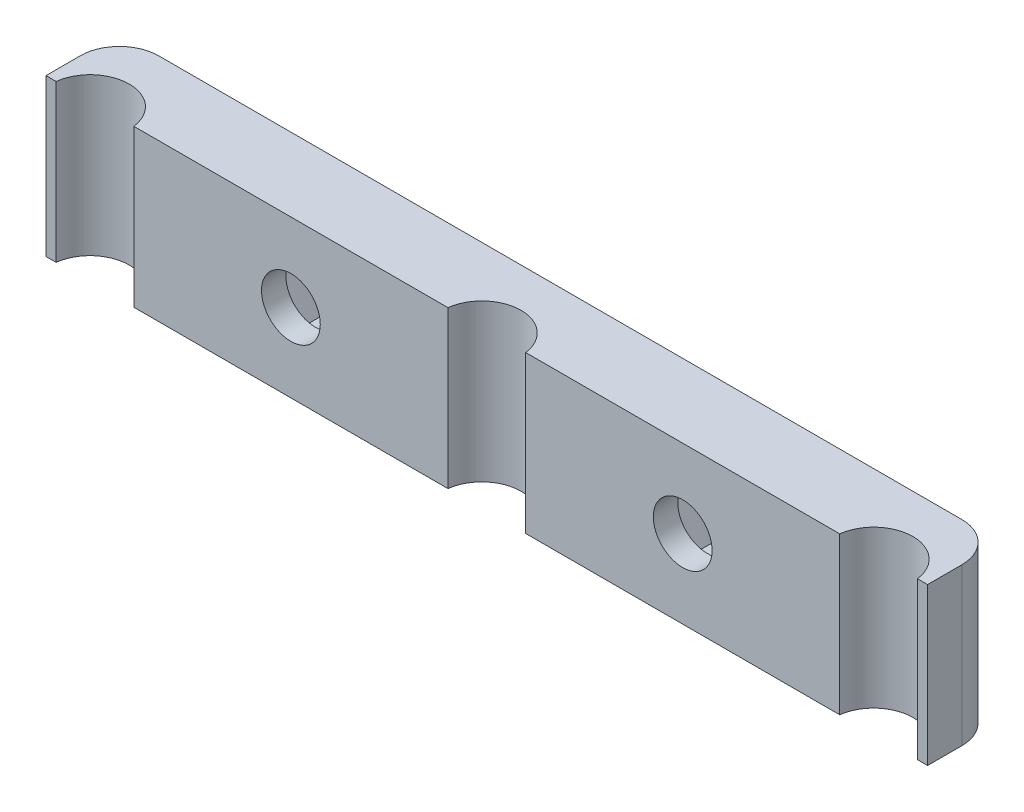
ISO-10303-21;
HEADER;
FILE_DESCRIPTION(('STEP AP214'),'2;1');
FILE_NAME('part.step','',(''),(''),'','','');
FILE_SCHEMA(('AUTOMOTIVE_DESIGN { 1 0 10303 214 1 1 1 1 }'));
ENDSEC;
DATA;
#1=APPLICATION_CONTEXT('core data for automotive mechanical design processes');
#2=APPLICATION_PROTOCOL_DEFINITION('international standard','automotive_design',2000,#1);
#3=PRODUCT_CONTEXT('',#1,'mechanical');
#4=PRODUCT('Part','Part','',(#3));
#5=PRODUCT_RELATED_PRODUCT_CATEGORY('part','',(#4));
#6=PRODUCT_DEFINITION_FORMATION('','',#4);
#7=PRODUCT_DEFINITION_CONTEXT('part definition',#1,'design');
#8=PRODUCT_DEFINITION('design','',#6,#7);
#9=PRODUCT_DEFINITION_SHAPE('','',#8);
#10=(LENGTH_UNIT() NAMED_UNIT(*) SI_UNIT(.MILLI.,.METRE.));
#11=(NAMED_UNIT(*) PLANE_ANGLE_UNIT() SI_UNIT($,.RADIAN.));
#12=(NAMED_UNIT(*) SI_UNIT($,.STERADIAN.) SOLID_ANGLE_UNIT());
#13=UNCERTAINTY_MEASURE_WITH_UNIT(LENGTH_MEASURE(1.E-05),#10,'distance_accuracy_value','');
#14=(GEOMETRIC_REPRESENTATION_CONTEXT(3) GLOBAL_UNCERTAINTY_ASSIGNED_CONTEXT((#13)) GLOBAL_UNIT_ASSIGNED_CONTEXT((#10,
#11,#12)) REPRESENTATION_CONTEXT('',''));
#15=CARTESIAN_POINT('',(0.,0.,0.));
#16=DIRECTION('',(0.,0.,1.));
#17=DIRECTION('',(1.,0.,0.));
#18=AXIS2_PLACEMENT_3D('',#15,#16,#17);
#19=CARTESIAN_POINT('',(-10.,0.,-4.));
#20=DIRECTION('',(0.,0.,1.));
#21=DIRECTION('',(1.,0.,0.));
#22=AXIS2_PLACEMENT_3D('',#19,#20,#21);
#23=CYLINDRICAL_SURFACE('',#22,1.5);
#24=CARTESIAN_POINT('',(-10.,0.,-0.25));
#25=DIRECTION('',(0.,0.,1.));
#26=DIRECTION('',(1.,0.,0.));
#27=AXIS2_PLACEMENT_3D('',#24,#25,#26);
#28=CIRCLE('',#27,1.5);
#29=CARTESIAN_POINT('',(-8.5,0.,-0.25));
#30=VERTEX_POINT('',#29);
#31=EDGE_CURVE('E300',#30,#30,#28,.T.);
#32=ORIENTED_EDGE('',*,*,#31,.T.);
#33=EDGE_LOOP('',(#32));
#34=FACE_BOUND('',#33,.T.);
#35=CARTESIAN_POINT('',(-10.,0.,-1.5));
#36=DIRECTION('',(0.,0.,-1.));
#37=DIRECTION('',(-1.,0.,0.));
#38=AXIS2_PLACEMENT_3D('',#35,#36,#37);
#39=CIRCLE('',#38,1.5);
#40=CARTESIAN_POINT('',(-11.5,0.,-1.5));
#41=VERTEX_POINT('',#40);
#42=EDGE_CURVE('E37',#41,#41,#39,.F.);
#43=ORIENTED_EDGE('',*,*,#42,.F.);
#44=EDGE_LOOP('',(#43));
#45=FACE_BOUND('',#44,.T.);
#46=ADVANCED_FACE('F33',(#34,#45),#23,.F.);
#47=CARTESIAN_POINT('',(10.,0.,-4.));
#48=DIRECTION('',(0.,0.,1.));
#49=DIRECTION('',(1.,0.,0.));
#50=AXIS2_PLACEMENT_3D('',#47,#48,#49);
#51=CYLINDRICAL_SURFACE('',#50,1.5);
#52=CARTESIAN_POINT('',(10.,0.,-0.25));
#53=DIRECTION('',(0.,0.,1.));
#54=DIRECTION('',(1.,0.,0.));
#55=AXIS2_PLACEMENT_3D('',#52,#53,#54);
#56=CIRCLE('',#55,1.5);
#57=CARTESIAN_POINT('',(11.5,0.,-0.25));
#58=VERTEX_POINT('',#57);
#59=EDGE_CURVE('E297',#58,#58,#56,.T.);
#60=ORIENTED_EDGE('',*,*,#59,.T.);
#61=EDGE_LOOP('',(#60));
#62=FACE_BOUND('',#61,.T.);
#63=CARTESIAN_POINT('',(10.,0.,-1.5));
#64=DIRECTION('',(0.,0.,-1.));
#65=DIRECTION('',(-1.,0.,0.));
#66=AXIS2_PLACEMENT_3D('',#63,#64,#65);
#67=CIRCLE('',#66,1.5);
#68=CARTESIAN_POINT('',(8.5,0.,-1.5));
#69=VERTEX_POINT('',#68);
#70=EDGE_CURVE('E287',#69,#69,#67,.F.);
#71=ORIENTED_EDGE('',*,*,#70,.F.);
#72=EDGE_LOOP('',(#71));
#73=FACE_BOUND('',#72,.T.);
#74=ADVANCED_FACE('F390',(#62,#73),#51,.F.);
#75=CARTESIAN_POINT('',(-22.5,4.,-4.));
#76=DIRECTION('',(1.,0.,0.));
#77=DIRECTION('',(0.,0.,-1.));
#78=AXIS2_PLACEMENT_3D('',#75,#76,#77);
#79=PLANE('',#78);
#80=DIRECTION('',(0.,0.,1.));
#81=VECTOR('',#80,1.);
#82=CARTESIAN_POINT('',(-22.5,4.,-4.));
#83=LINE('',#82,#81);
#84=CARTESIAN_POINT('',(-22.5,4.,-2.));
#85=VERTEX_POINT('',#84);
#86=CARTESIAN_POINT('',(-22.5,4.,-0.25));
#87=VERTEX_POINT('',#86);
#88=EDGE_CURVE('E304',#85,#87,#83,.T.);
#89=ORIENTED_EDGE('',*,*,#88,.F.);
#90=DIRECTION('',(0.,-1.,0.));
#91=VECTOR('',#90,1.);
#92=CARTESIAN_POINT('',(-22.5,4.,-2.));
#93=LINE('',#92,#91);
#94=CARTESIAN_POINT('',(-22.5,-4.,-2.));
#95=VERTEX_POINT('',#94);
#96=EDGE_CURVE('E371',#85,#95,#93,.T.);
#97=ORIENTED_EDGE('',*,*,#96,.T.);
#98=DIRECTION('',(0.,0.,1.));
#99=VECTOR('',#98,1.);
#100=CARTESIAN_POINT('',(-22.5,-4.,-4.));
#101=LINE('',#100,#99);
#102=CARTESIAN_POINT('',(-22.5,-4.,-0.25));
#103=VERTEX_POINT('',#102);
#104=EDGE_CURVE('E303',#95,#103,#101,.T.);
#105=ORIENTED_EDGE('',*,*,#104,.T.);
#106=DIRECTION('',(0.,-1.,0.));
#107=VECTOR('',#106,1.);
#108=CARTESIAN_POINT('',(-22.5,4.,-0.25));
#109=LINE('',#108,#107);
#110=EDGE_CURVE('E368',#87,#103,#109,.T.);
#111=ORIENTED_EDGE('',*,*,#110,.F.);
#112=EDGE_LOOP('',(#89,#97,#105,#111));
#113=FACE_BOUND('',#112,.T.);
#114=ADVANCED_FACE('F392',(#113),#79,.F.);
#115=CARTESIAN_POINT('',(-22.5,4.,-0.25));
#116=DIRECTION('',(0.,0.,-1.));
#117=DIRECTION('',(-1.,0.,0.));
#118=AXIS2_PLACEMENT_3D('',#115,#116,#117);
#119=PLANE('',#118);
#120=DIRECTION('',(1.,0.,0.));
#121=VECTOR('',#120,1.);
#122=CARTESIAN_POINT('',(-22.5,-4.,-0.25));
#123=LINE('',#122,#121);
#124=CARTESIAN_POINT('',(-21.9843134832984,-4.,-0.250000000000001));
#125=VERTEX_POINT('',#124);
#126=EDGE_CURVE('E329',#103,#125,#123,.T.);
#127=ORIENTED_EDGE('',*,*,#126,.T.);
#128=DIRECTION('',(0.,-1.,0.));
#129=VECTOR('',#128,1.);
#130=CARTESIAN_POINT('',(-21.9843134832984,4.,-0.250000000000001));
#131=LINE('',#130,#129);
#132=CARTESIAN_POINT('',(-21.9843134832984,4.,-0.250000000000001));
#133=VERTEX_POINT('',#132);
#134=EDGE_CURVE('E365',#133,#125,#131,.T.);
#135=ORIENTED_EDGE('',*,*,#134,.F.);
#136=DIRECTION('',(1.,0.,0.));
#137=VECTOR('',#136,1.);
#138=CARTESIAN_POINT('',(-22.5,4.,-0.25));
#139=LINE('',#138,#137);
#140=EDGE_CURVE('E306',#87,#133,#139,.T.);
#141=ORIENTED_EDGE('',*,*,#140,.F.);
#142=ORIENTED_EDGE('',*,*,#110,.T.);
#143=EDGE_LOOP('',(#127,#135,#141,#142));
#144=FACE_BOUND('',#143,.T.);
#145=ADVANCED_FACE('F399',(#144),#119,.F.);
#146=CARTESIAN_POINT('',(-20.,4.,0.));
#147=DIRECTION('',(0.,-1.,0.));
#148=DIRECTION('',(0.,0.,-1.));
#149=AXIS2_PLACEMENT_3D('',#146,#147,#148);
#150=CYLINDRICAL_SURFACE('',#149,2.);
#151=CARTESIAN_POINT('',(-20.,-4.,0.));
#152=DIRECTION('',(0.,-1.,0.));
#153=DIRECTION('',(0.,0.,1.));
#154=AXIS2_PLACEMENT_3D('',#151,#152,#153);
#155=CIRCLE('',#154,2.);
#156=CARTESIAN_POINT('',(-18.0156865167016,-4.,-0.25));
#157=VERTEX_POINT('',#156);
#158=EDGE_CURVE('E331',#125,#157,#155,.T.);
#159=ORIENTED_EDGE('',*,*,#158,.T.);
#160=DIRECTION('',(0.,-1.,0.));
#161=VECTOR('',#160,1.);
#162=CARTESIAN_POINT('',(-18.0156865167016,4.,-0.25));
#163=LINE('',#162,#161);
#164=CARTESIAN_POINT('',(-18.0156865167016,4.,-0.25));
#165=VERTEX_POINT('',#164);
#166=EDGE_CURVE('E362',#165,#157,#163,.T.);
#167=ORIENTED_EDGE('',*,*,#166,.F.);
#168=CARTESIAN_POINT('',(-20.,4.,0.));
#169=DIRECTION('',(0.,-1.,0.));
#170=DIRECTION('',(0.,0.,1.));
#171=AXIS2_PLACEMENT_3D('',#168,#169,#170);
#172=CIRCLE('',#171,2.);
#173=EDGE_CURVE('E309',#133,#165,#172,.T.);
#174=ORIENTED_EDGE('',*,*,#173,.F.);
#175=ORIENTED_EDGE('',*,*,#134,.T.);
#176=EDGE_LOOP('',(#159,#167,#174,#175));
#177=FACE_BOUND('',#176,.T.);
#178=ADVANCED_FACE('F444',(#177),#150,.F.);
#179=CARTESIAN_POINT('',(-18.0156865167016,4.,-0.25));
#180=DIRECTION('',(0.,0.,-1.));
#181=DIRECTION('',(-1.,0.,0.));
#182=AXIS2_PLACEMENT_3D('',#179,#180,#181);
#183=PLANE('',#182);
#184=ORIENTED_EDGE('',*,*,#31,.F.);
#185=EDGE_LOOP('',(#184));
#186=FACE_BOUND('',#185,.T.);
#187=DIRECTION('',(1.,0.,0.));
#188=VECTOR('',#187,1.);
#189=CARTESIAN_POINT('',(-18.0156865167016,-4.,-0.25));
#190=LINE('',#189,#188);
#191=CARTESIAN_POINT('',(-1.98431348329844,-4.,-0.25));
#192=VERTEX_POINT('',#191);
#193=EDGE_CURVE('E333',#157,#192,#190,.T.);
#194=ORIENTED_EDGE('',*,*,#193,.T.);
#195=DIRECTION('',(0.,-1.,0.));
#196=VECTOR('',#195,1.);
#197=CARTESIAN_POINT('',(-1.98431348329844,4.,-0.25));
#198=LINE('',#197,#196);
#199=CARTESIAN_POINT('',(-1.98431348329844,4.,-0.25));
#200=VERTEX_POINT('',#199);
#201=EDGE_CURVE('E359',#200,#192,#198,.T.);
#202=ORIENTED_EDGE('',*,*,#201,.F.);
#203=DIRECTION('',(1.,0.,0.));
#204=VECTOR('',#203,1.);
#205=CARTESIAN_POINT('',(-18.0156865167016,4.,-0.25));
#206=LINE('',#205,#204);
#207=EDGE_CURVE('E311',#165,#200,#206,.T.);
#208=ORIENTED_EDGE('',*,*,#207,.F.);
#209=ORIENTED_EDGE('',*,*,#166,.T.);
#210=EDGE_LOOP('',(#194,#202,#208,#209));
#211=FACE_BOUND('',#210,.T.);
#212=ADVANCED_FACE('F440',(#186,#211),#183,.F.);
#213=CARTESIAN_POINT('',(0.,4.,0.));
#214=DIRECTION('',(0.,-1.,0.));
#215=DIRECTION('',(0.,0.,-1.));
#216=AXIS2_PLACEMENT_3D('',#213,#214,#215);
#217=CYLINDRICAL_SURFACE('',#216,2.);
#218=CARTESIAN_POINT('',(0.,-4.,0.));
#219=DIRECTION('',(0.,-1.,0.));
#220=DIRECTION('',(0.,0.,1.));
#221=AXIS2_PLACEMENT_3D('',#218,#219,#220);
#222=CIRCLE('',#221,2.);
#223=CARTESIAN_POINT('',(1.98431348329844,-4.,-0.25));
#224=VERTEX_POINT('',#223);
#225=EDGE_CURVE('E335',#192,#224,#222,.T.);
#226=ORIENTED_EDGE('',*,*,#225,.T.);
#227=DIRECTION('',(0.,-1.,0.));
#228=VECTOR('',#227,1.);
#229=CARTESIAN_POINT('',(1.98431348329844,4.,-0.25));
#230=LINE('',#229,#228);
#231=CARTESIAN_POINT('',(1.98431348329844,4.,-0.25));
#232=VERTEX_POINT('',#231);
#233=EDGE_CURVE('E356',#232,#224,#230,.T.);
#234=ORIENTED_EDGE('',*,*,#233,.F.);
#235=CARTESIAN_POINT('',(0.,4.,0.));
#236=DIRECTION('',(0.,-1.,0.));
#237=DIRECTION('',(0.,0.,1.));
#238=AXIS2_PLACEMENT_3D('',#235,#236,#237);
#239=CIRCLE('',#238,2.);
#240=EDGE_CURVE('E313',#200,#232,#239,.T.);
#241=ORIENTED_EDGE('',*,*,#240,.F.);
#242=ORIENTED_EDGE('',*,*,#201,.T.);
#243=EDGE_LOOP('',(#226,#234,#241,#242));
#244=FACE_BOUND('',#243,.T.);
#245=ADVANCED_FACE('F436',(#244),#217,.F.);
#246=CARTESIAN_POINT('',(18.0156865167016,4.,-0.25));
#247=DIRECTION('',(0.,0.,-1.));
#248=DIRECTION('',(-1.,0.,0.));
#249=AXIS2_PLACEMENT_3D('',#246,#247,#248);
#250=PLANE('',#249);
#251=ORIENTED_EDGE('',*,*,#59,.F.);
#252=EDGE_LOOP('',(#251));
#253=FACE_BOUND('',#252,.T.);
#254=DIRECTION('',(1.,0.,0.));
#255=VECTOR('',#254,1.);
#256=CARTESIAN_POINT('',(18.0156865167016,-4.,-0.25));
#257=LINE('',#256,#255);
#258=CARTESIAN_POINT('',(18.0156865167016,-4.,-0.249999999999999));
#259=VERTEX_POINT('',#258);
#260=EDGE_CURVE('E337',#224,#259,#257,.T.);
#261=ORIENTED_EDGE('',*,*,#260,.T.);
#262=DIRECTION('',(0.,-1.,0.));
#263=VECTOR('',#262,1.);
#264=CARTESIAN_POINT('',(18.0156865167016,4.,-0.249999999999999));
#265=LINE('',#264,#263);
#266=CARTESIAN_POINT('',(18.0156865167016,4.,-0.249999999999999));
#267=VERTEX_POINT('',#266);
#268=EDGE_CURVE('E353',#267,#259,#265,.T.);
#269=ORIENTED_EDGE('',*,*,#268,.F.);
#270=DIRECTION('',(1.,0.,0.));
#271=VECTOR('',#270,1.);
#272=CARTESIAN_POINT('',(18.0156865167016,4.,-0.25));
#273=LINE('',#272,#271);
#274=EDGE_CURVE('E315',#232,#267,#273,.T.);
#275=ORIENTED_EDGE('',*,*,#274,.F.);
#276=ORIENTED_EDGE('',*,*,#233,.T.);
#277=EDGE_LOOP('',(#261,#269,#275,#276));
#278=FACE_BOUND('',#277,.T.);
#279=ADVANCED_FACE('F432',(#253,#278),#250,.F.);
#280=CARTESIAN_POINT('',(20.,4.,0.));
#281=DIRECTION('',(0.,-1.,0.));
#282=DIRECTION('',(0.,0.,-1.));
#283=AXIS2_PLACEMENT_3D('',#280,#281,#282);
#284=CYLINDRICAL_SURFACE('',#283,2.);
#285=CARTESIAN_POINT('',(20.,-4.,0.));
#286=DIRECTION('',(0.,-1.,0.));
#287=DIRECTION('',(0.,0.,-1.));
#288=AXIS2_PLACEMENT_3D('',#285,#286,#287);
#289=CIRCLE('',#288,2.);
#290=CARTESIAN_POINT('',(21.9843134832984,-4.,-0.25));
#291=VERTEX_POINT('',#290);
#292=EDGE_CURVE('E339',#259,#291,#289,.T.);
#293=ORIENTED_EDGE('',*,*,#292,.T.);
#294=DIRECTION('',(0.,-1.,0.));
#295=VECTOR('',#294,1.);
#296=CARTESIAN_POINT('',(21.9843134832984,4.,-0.25));
#297=LINE('',#296,#295);
#298=CARTESIAN_POINT('',(21.9843134832984,4.,-0.25));
#299=VERTEX_POINT('',#298);
#300=EDGE_CURVE('E350',#299,#291,#297,.T.);
#301=ORIENTED_EDGE('',*,*,#300,.F.);
#302=CARTESIAN_POINT('',(20.,4.,0.));
#303=DIRECTION('',(0.,-1.,0.));
#304=DIRECTION('',(0.,0.,-1.));
#305=AXIS2_PLACEMENT_3D('',#302,#303,#304);
#306=CIRCLE('',#305,2.);
#307=EDGE_CURVE('E317',#267,#299,#306,.T.);
#308=ORIENTED_EDGE('',*,*,#307,.F.);
#309=ORIENTED_EDGE('',*,*,#268,.T.);
#310=EDGE_LOOP('',(#293,#301,#308,#309));
#311=FACE_BOUND('',#310,.T.);
#312=ADVANCED_FACE('F428',(#311),#284,.F.);
#313=CARTESIAN_POINT('',(22.5,4.,-0.25));
#314=DIRECTION('',(0.,0.,-1.));
#315=DIRECTION('',(-1.,0.,0.));
#316=AXIS2_PLACEMENT_3D('',#313,#314,#315);
#317=PLANE('',#316);
#318=DIRECTION('',(1.,0.,0.));
#319=VECTOR('',#318,1.);
#320=CARTESIAN_POINT('',(22.5,-4.,-0.25));
#321=LINE('',#320,#319);
#322=CARTESIAN_POINT('',(22.5,-4.,-0.25));
#323=VERTEX_POINT('',#322);
#324=EDGE_CURVE('E341',#291,#323,#321,.T.);
#325=ORIENTED_EDGE('',*,*,#324,.T.);
#326=DIRECTION('',(0.,-1.,0.));
#327=VECTOR('',#326,1.);
#328=CARTESIAN_POINT('',(22.5,4.,-0.25));
#329=LINE('',#328,#327);
#330=CARTESIAN_POINT('',(22.5,4.,-0.25));
#331=VERTEX_POINT('',#330);
#332=EDGE_CURVE('E327',#331,#323,#329,.T.);
#333=ORIENTED_EDGE('',*,*,#332,.F.);
#334=DIRECTION('',(1.,0.,0.));
#335=VECTOR('',#334,1.);
#336=CARTESIAN_POINT('',(22.5,4.,-0.25));
#337=LINE('',#336,#335);
#338=EDGE_CURVE('E319',#299,#331,#337,.T.);
#339=ORIENTED_EDGE('',*,*,#338,.F.);
#340=ORIENTED_EDGE('',*,*,#300,.T.);
#341=EDGE_LOOP('',(#325,#333,#339,#340));
#342=FACE_BOUND('',#341,.T.);
#343=ADVANCED_FACE('F424',(#342),#317,.F.);
#344=CARTESIAN_POINT('',(22.5,4.,-4.));
#345=DIRECTION('',(-1.,0.,0.));
#346=DIRECTION('',(0.,0.,1.));
#347=AXIS2_PLACEMENT_3D('',#344,#345,#346);
#348=PLANE('',#347);
#349=DIRECTION('',(0.,0.,-1.));
#350=VECTOR('',#349,1.);
#351=CARTESIAN_POINT('',(22.5,-4.,-4.));
#352=LINE('',#351,#350);
#353=CARTESIAN_POINT('',(22.5,-4.,-2.));
#354=VERTEX_POINT('',#353);
#355=EDGE_CURVE('E343',#323,#354,#352,.T.);
#356=ORIENTED_EDGE('',*,*,#355,.T.);
#357=DIRECTION('',(0.,-1.,0.));
#358=VECTOR('',#357,1.);
#359=CARTESIAN_POINT('',(22.5,4.,-2.));
#360=LINE('',#359,#358);
#361=CARTESIAN_POINT('',(22.5,4.,-2.));
#362=VERTEX_POINT('',#361);
#363=EDGE_CURVE('E11',#354,#362,#360,.F.);
#364=ORIENTED_EDGE('',*,*,#363,.T.);
#365=DIRECTION('',(0.,0.,-1.));
#366=VECTOR('',#365,1.);
#367=CARTESIAN_POINT('',(22.5,4.,-4.));
#368=LINE('',#367,#366);
#369=EDGE_CURVE('E321',#331,#362,#368,.T.);
#370=ORIENTED_EDGE('',*,*,#369,.F.);
#371=ORIENTED_EDGE('',*,*,#332,.T.);
#372=EDGE_LOOP('',(#356,#364,#370,#371));
#373=FACE_BOUND('',#372,.T.);
#374=ADVANCED_FACE('F420',(#373),#348,.F.);
#375=CARTESIAN_POINT('',(22.5,4.,-4.));
#376=DIRECTION('',(0.,0.,1.));
#377=DIRECTION('',(1.,0.,0.));
#378=AXIS2_PLACEMENT_3D('',#375,#376,#377);
#379=PLANE('',#378);
#380=DIRECTION('',(1.,0.,0.));
#381=VECTOR('',#380,1.);
#382=CARTESIAN_POINT('',(-11.5877132402715,2.75,-4.));
#383=LINE('',#382,#381);
#384=CARTESIAN_POINT('',(-11.5877132402715,2.75,-4.));
#385=VERTEX_POINT('',#384);
#386=CARTESIAN_POINT('',(-8.41228675972853,2.75,-4.));
#387=VERTEX_POINT('',#386);
#388=EDGE_CURVE('E231',#385,#387,#383,.T.);
#389=ORIENTED_EDGE('',*,*,#388,.F.);
#390=DIRECTION('',(0.5,0.866025403784438,0.));
#391=VECTOR('',#390,1.);
#392=CARTESIAN_POINT('',(-13.1754264805429,0.,-4.));
#393=LINE('',#392,#391);
#394=CARTESIAN_POINT('',(-13.1754264805429,0.,-4.));
#395=VERTEX_POINT('',#394);
#396=EDGE_CURVE('E50',#395,#385,#393,.T.);
#397=ORIENTED_EDGE('',*,*,#396,.F.);
#398=DIRECTION('',(-0.5,0.866025403784439,0.));
#399=VECTOR('',#398,1.);
#400=CARTESIAN_POINT('',(-11.5877132402715,-2.75000000000001,-4.));
#401=LINE('',#400,#399);
#402=CARTESIAN_POINT('',(-11.5877132402715,-2.75000000000001,-4.));
#403=VERTEX_POINT('',#402);
#404=EDGE_CURVE('E217',#403,#395,#401,.T.);
#405=ORIENTED_EDGE('',*,*,#404,.F.);
#406=DIRECTION('',(-1.,0.,0.));
#407=VECTOR('',#406,1.);
#408=CARTESIAN_POINT('',(-8.41228675972853,-2.75000000000001,-4.));
#409=LINE('',#408,#407);
#410=CARTESIAN_POINT('',(-8.41228675972853,-2.75000000000001,-4.));
#411=VERTEX_POINT('',#410);
#412=EDGE_CURVE('E220',#411,#403,#409,.T.);
#413=ORIENTED_EDGE('',*,*,#412,.F.);
#414=DIRECTION('',(-0.5,-0.866025403784438,0.));
#415=VECTOR('',#414,1.);
#416=CARTESIAN_POINT('',(-6.82457351945706,0.,-4.));
#417=LINE('',#416,#415);
#418=CARTESIAN_POINT('',(-6.82457351945706,0.,-4.));
#419=VERTEX_POINT('',#418);
#420=EDGE_CURVE('E236',#419,#411,#417,.T.);
#421=ORIENTED_EDGE('',*,*,#420,.F.);
#422=DIRECTION('',(0.499999999999999,-0.866025403784439,0.));
#423=VECTOR('',#422,1.);
#424=CARTESIAN_POINT('',(-8.41228675972853,2.75,-4.));
#425=LINE('',#424,#423);
#426=EDGE_CURVE('E233',#387,#419,#425,.T.);
#427=ORIENTED_EDGE('',*,*,#426,.F.);
#428=EDGE_LOOP('',(#389,#397,#405,#413,#421,#427));
#429=FACE_BOUND('',#428,.T.);
#430=DIRECTION('',(1.,0.,0.));
#431=VECTOR('',#430,1.);
#432=CARTESIAN_POINT('',(8.41228675972853,2.75,-4.));
#433=LINE('',#432,#431);
#434=CARTESIAN_POINT('',(8.41228675972853,2.75,-4.));
#435=VERTEX_POINT('',#434);
#436=CARTESIAN_POINT('',(11.5877132402715,2.75,-4.));
#437=VERTEX_POINT('',#436);
#438=EDGE_CURVE('E271',#435,#437,#433,.T.);
#439=ORIENTED_EDGE('',*,*,#438,.F.);
#440=DIRECTION('',(0.5,0.866025403784438,0.));
#441=VECTOR('',#440,1.);
#442=CARTESIAN_POINT('',(6.82457351945705,0.,-4.));
#443=LINE('',#442,#441);
#444=CARTESIAN_POINT('',(6.82457351945705,0.,-4.));
#445=VERTEX_POINT('',#444);
#446=EDGE_CURVE('E58',#445,#435,#443,.T.);
#447=ORIENTED_EDGE('',*,*,#446,.F.);
#448=DIRECTION('',(-0.5,0.866025403784438,0.));
#449=VECTOR('',#448,1.);
#450=CARTESIAN_POINT('',(8.41228675972852,-2.75,-4.));
#451=LINE('',#450,#449);
#452=CARTESIAN_POINT('',(8.41228675972852,-2.75,-4.));
#453=VERTEX_POINT('',#452);
#454=EDGE_CURVE('E254',#453,#445,#451,.T.);
#455=ORIENTED_EDGE('',*,*,#454,.F.);
#456=DIRECTION('',(-1.,0.,0.));
#457=VECTOR('',#456,1.);
#458=CARTESIAN_POINT('',(11.5877132402715,-2.75,-4.));
#459=LINE('',#458,#457);
#460=CARTESIAN_POINT('',(11.5877132402715,-2.75,-4.));
#461=VERTEX_POINT('',#460);
#462=EDGE_CURVE('E280',#461,#453,#459,.T.);
#463=ORIENTED_EDGE('',*,*,#462,.F.);
#464=DIRECTION('',(-0.5,-0.866025403784438,0.));
#465=VECTOR('',#464,1.);
#466=CARTESIAN_POINT('',(13.1754264805429,0.,-4.));
#467=LINE('',#466,#465);
#468=CARTESIAN_POINT('',(13.1754264805429,0.,-4.));
#469=VERTEX_POINT('',#468);
#470=EDGE_CURVE('E277',#469,#461,#467,.T.);
#471=ORIENTED_EDGE('',*,*,#470,.F.);
#472=DIRECTION('',(0.500000000000001,-0.866025403784438,0.));
#473=VECTOR('',#472,1.);
#474=CARTESIAN_POINT('',(11.5877132402715,2.75,-4.));
#475=LINE('',#474,#473);
#476=EDGE_CURVE('E274',#437,#469,#475,.T.);
#477=ORIENTED_EDGE('',*,*,#476,.F.);
#478=EDGE_LOOP('',(#439,#447,#455,#463,#471,#477));
#479=FACE_BOUND('',#478,.T.);
#480=DIRECTION('',(-1.,0.,0.));
#481=VECTOR('',#480,1.);
#482=CARTESIAN_POINT('',(22.5,-4.,-4.));
#483=LINE('',#482,#481);
#484=CARTESIAN_POINT('',(20.5,-4.,-4.));
#485=VERTEX_POINT('',#484);
#486=CARTESIAN_POINT('',(-20.5,-4.,-4.));
#487=VERTEX_POINT('',#486);
#488=EDGE_CURVE('E307',#485,#487,#483,.T.);
#489=ORIENTED_EDGE('',*,*,#488,.T.);
#490=DIRECTION('',(0.,-1.,0.));
#491=VECTOR('',#490,1.);
#492=CARTESIAN_POINT('',(-20.5,4.,-4.));
#493=LINE('',#492,#491);
#494=CARTESIAN_POINT('',(-20.5,4.,-4.));
#495=VERTEX_POINT('',#494);
#496=EDGE_CURVE('E381',#487,#495,#493,.F.);
#497=ORIENTED_EDGE('',*,*,#496,.T.);
#498=DIRECTION('',(-1.,0.,0.));
#499=VECTOR('',#498,1.);
#500=CARTESIAN_POINT('',(22.5,4.,-4.));
#501=LINE('',#500,#499);
#502=CARTESIAN_POINT('',(20.5,4.,-4.));
#503=VERTEX_POINT('',#502);
#504=EDGE_CURVE('E324',#503,#495,#501,.T.);
#505=ORIENTED_EDGE('',*,*,#504,.F.);
#506=DIRECTION('',(0.,-1.,0.));
#507=VECTOR('',#506,1.);
#508=CARTESIAN_POINT('',(20.5,4.,-4.));
#509=LINE('',#508,#507);
#510=EDGE_CURVE('E378',#503,#485,#509,.T.);
#511=ORIENTED_EDGE('',*,*,#510,.T.);
#512=EDGE_LOOP('',(#489,#497,#505,#511));
#513=FACE_BOUND('',#512,.T.);
#514=ADVANCED_FACE('F412',(#429,#479,#513),#379,.F.);
#515=CARTESIAN_POINT('',(-20.,4.,0.));
#516=DIRECTION('',(0.,1.,0.));
#517=DIRECTION('',(0.,0.,1.));
#518=AXIS2_PLACEMENT_3D('',#515,#516,#517);
#519=PLANE('',#518);
#520=ORIENTED_EDGE('',*,*,#504,.T.);
#521=CARTESIAN_POINT('',(-20.5,4.,-2.));
#522=DIRECTION('',(0.,1.,0.));
#523=DIRECTION('',(0.,0.,1.));
#524=AXIS2_PLACEMENT_3D('',#521,#522,#523);
#525=CIRCLE('',#524,2.);
#526=EDGE_CURVE('E42',#495,#85,#525,.T.);
#527=ORIENTED_EDGE('',*,*,#526,.T.);
#528=ORIENTED_EDGE('',*,*,#88,.T.);
#529=ORIENTED_EDGE('',*,*,#140,.T.);
#530=ORIENTED_EDGE('',*,*,#173,.T.);
#531=ORIENTED_EDGE('',*,*,#207,.T.);
#532=ORIENTED_EDGE('',*,*,#240,.T.);
#533=ORIENTED_EDGE('',*,*,#274,.T.);
#534=ORIENTED_EDGE('',*,*,#307,.T.);
#535=ORIENTED_EDGE('',*,*,#338,.T.);
#536=ORIENTED_EDGE('',*,*,#369,.T.);
#537=CARTESIAN_POINT('',(20.5,4.,-2.));
#538=DIRECTION('',(0.,1.,0.));
#539=DIRECTION('',(0.,0.,1.));
#540=AXIS2_PLACEMENT_3D('',#537,#538,#539);
#541=CIRCLE('',#540,2.);
#542=EDGE_CURVE('E383',#362,#503,#541,.T.);
#543=ORIENTED_EDGE('',*,*,#542,.T.);
#544=EDGE_LOOP('',(#520,#527,#528,#529,#530,#531,#532,#533,#534,#535,#536,#543));
#545=FACE_BOUND('',#544,.T.);
#546=ADVANCED_FACE('F408',(#545),#519,.T.);
#547=CARTESIAN_POINT('',(-20.,-4.,0.));
#548=DIRECTION('',(0.,1.,0.));
#549=DIRECTION('',(0.,0.,1.));
#550=AXIS2_PLACEMENT_3D('',#547,#548,#549);
#551=PLANE('',#550);
#552=ORIENTED_EDGE('',*,*,#104,.F.);
#553=CARTESIAN_POINT('',(-20.5,-4.,-2.));
#554=DIRECTION('',(0.,1.,0.));
#555=DIRECTION('',(0.,0.,1.));
#556=AXIS2_PLACEMENT_3D('',#553,#554,#555);
#557=CIRCLE('',#556,2.);
#558=EDGE_CURVE('E376',#95,#487,#557,.F.);
#559=ORIENTED_EDGE('',*,*,#558,.T.);
#560=ORIENTED_EDGE('',*,*,#488,.F.);
#561=CARTESIAN_POINT('',(20.5,-4.,-2.));
#562=DIRECTION('',(0.,1.,0.));
#563=DIRECTION('',(0.,0.,1.));
#564=AXIS2_PLACEMENT_3D('',#561,#562,#563);
#565=CIRCLE('',#564,2.);
#566=EDGE_CURVE('E374',#485,#354,#565,.F.);
#567=ORIENTED_EDGE('',*,*,#566,.T.);
#568=ORIENTED_EDGE('',*,*,#355,.F.);
#569=ORIENTED_EDGE('',*,*,#324,.F.);
#570=ORIENTED_EDGE('',*,*,#292,.F.);
#571=ORIENTED_EDGE('',*,*,#260,.F.);
#572=ORIENTED_EDGE('',*,*,#225,.F.);
#573=ORIENTED_EDGE('',*,*,#193,.F.);
#574=ORIENTED_EDGE('',*,*,#158,.F.);
#575=ORIENTED_EDGE('',*,*,#126,.F.);
#576=EDGE_LOOP('',(#552,#559,#560,#567,#568,#569,#570,#571,#572,#573,#574,#575));
#577=FACE_BOUND('',#576,.T.);
#578=ADVANCED_FACE('F411',(#577),#551,.F.);
#579=CARTESIAN_POINT('',(-20.5,4.,-2.));
#580=DIRECTION('',(0.,-1.,0.));
#581=DIRECTION('',(0.,0.,-1.));
#582=AXIS2_PLACEMENT_3D('',#579,#580,#581);
#583=CYLINDRICAL_SURFACE('',#582,2.);
#584=ORIENTED_EDGE('',*,*,#526,.F.);
#585=ORIENTED_EDGE('',*,*,#496,.F.);
#586=ORIENTED_EDGE('',*,*,#558,.F.);
#587=ORIENTED_EDGE('',*,*,#96,.F.);
#588=EDGE_LOOP('',(#584,#585,#586,#587));
#589=FACE_BOUND('',#588,.T.);
#590=ADVANCED_FACE('F416',(#589),#583,.T.);
#591=CARTESIAN_POINT('',(20.5,4.,-2.));
#592=DIRECTION('',(0.,-1.,0.));
#593=DIRECTION('',(0.,0.,-1.));
#594=AXIS2_PLACEMENT_3D('',#591,#592,#593);
#595=CYLINDRICAL_SURFACE('',#594,2.);
#596=ORIENTED_EDGE('',*,*,#542,.F.);
#597=ORIENTED_EDGE('',*,*,#363,.F.);
#598=ORIENTED_EDGE('',*,*,#566,.F.);
#599=ORIENTED_EDGE('',*,*,#510,.F.);
#600=EDGE_LOOP('',(#596,#597,#598,#599));
#601=FACE_BOUND('',#600,.T.);
#602=ADVANCED_FACE('F35',(#601),#595,.T.);
#603=CARTESIAN_POINT('',(0.,0.,-1.5));
#604=DIRECTION('',(0.,0.,-1.));
#605=DIRECTION('',(-1.,0.,0.));
#606=AXIS2_PLACEMENT_3D('',#603,#604,#605);
#607=PLANE('',#606);
#608=DIRECTION('',(0.5,0.866025403784438,0.));
#609=VECTOR('',#608,1.);
#610=CARTESIAN_POINT('',(6.82457351945705,0.,-1.5));
#611=LINE('',#610,#609);
#612=CARTESIAN_POINT('',(6.82457351945705,0.,-1.5));
#613=VERTEX_POINT('',#612);
#614=CARTESIAN_POINT('',(8.41228675972853,2.75,-1.5));
#615=VERTEX_POINT('',#614);
#616=EDGE_CURVE('E250',#613,#615,#611,.T.);
#617=ORIENTED_EDGE('',*,*,#616,.T.);
#618=DIRECTION('',(1.,0.,0.));
#619=VECTOR('',#618,1.);
#620=CARTESIAN_POINT('',(8.41228675972853,2.75,-1.5));
#621=LINE('',#620,#619);
#622=CARTESIAN_POINT('',(11.5877132402715,2.75,-1.5));
#623=VERTEX_POINT('',#622);
#624=EDGE_CURVE('E253',#615,#623,#621,.T.);
#625=ORIENTED_EDGE('',*,*,#624,.T.);
#626=DIRECTION('',(0.500000000000001,-0.866025403784438,0.));
#627=VECTOR('',#626,1.);
#628=CARTESIAN_POINT('',(11.5877132402715,2.75,-1.5));
#629=LINE('',#628,#627);
#630=CARTESIAN_POINT('',(13.1754264805429,0.,-1.5));
#631=VERTEX_POINT('',#630);
#632=EDGE_CURVE('E257',#623,#631,#629,.T.);
#633=ORIENTED_EDGE('',*,*,#632,.T.);
#634=DIRECTION('',(-0.5,-0.866025403784438,0.));
#635=VECTOR('',#634,1.);
#636=CARTESIAN_POINT('',(13.1754264805429,0.,-1.5));
#637=LINE('',#636,#635);
#638=CARTESIAN_POINT('',(11.5877132402715,-2.75,-1.5));
#639=VERTEX_POINT('',#638);
#640=EDGE_CURVE('E260',#631,#639,#637,.T.);
#641=ORIENTED_EDGE('',*,*,#640,.T.);
#642=DIRECTION('',(-1.,0.,0.));
#643=VECTOR('',#642,1.);
#644=CARTESIAN_POINT('',(11.5877132402715,-2.75,-1.5));
#645=LINE('',#644,#643);
#646=CARTESIAN_POINT('',(8.41228675972852,-2.75,-1.5));
#647=VERTEX_POINT('',#646);
#648=EDGE_CURVE('E263',#639,#647,#645,.T.);
#649=ORIENTED_EDGE('',*,*,#648,.T.);
#650=DIRECTION('',(-0.5,0.866025403784438,0.));
#651=VECTOR('',#650,1.);
#652=CARTESIAN_POINT('',(8.41228675972852,-2.75,-1.5));
#653=LINE('',#652,#651);
#654=EDGE_CURVE('E266',#647,#613,#653,.T.);
#655=ORIENTED_EDGE('',*,*,#654,.T.);
#656=EDGE_LOOP('',(#617,#625,#633,#641,#649,#655));
#657=FACE_BOUND('',#656,.T.);
#658=ORIENTED_EDGE('',*,*,#70,.T.);
#659=EDGE_LOOP('',(#658));
#660=FACE_BOUND('',#659,.T.);
#661=ADVANCED_FACE('F388',(#657,#660),#607,.T.);
#662=CARTESIAN_POINT('',(6.82457351945705,0.,-1.5));
#663=DIRECTION('',(-0.866025403784438,0.5,0.));
#664=DIRECTION('',(-0.5,-0.866025403784438,0.));
#665=AXIS2_PLACEMENT_3D('',#662,#663,#664);
#666=PLANE('',#665);
#667=ORIENTED_EDGE('',*,*,#446,.T.);
#668=DIRECTION('',(0.,0.,-1.));
#669=VECTOR('',#668,1.);
#670=CARTESIAN_POINT('',(8.41228675972853,2.75,-1.5));
#671=LINE('',#670,#669);
#672=EDGE_CURVE('E269',#615,#435,#671,.T.);
#673=ORIENTED_EDGE('',*,*,#672,.F.);
#674=ORIENTED_EDGE('',*,*,#616,.F.);
#675=DIRECTION('',(0.,0.,-1.));
#676=VECTOR('',#675,1.);
#677=CARTESIAN_POINT('',(6.82457351945705,0.,-1.5));
#678=LINE('',#677,#676);
#679=EDGE_CURVE('E285',#613,#445,#678,.T.);
#680=ORIENTED_EDGE('',*,*,#679,.T.);
#681=EDGE_LOOP('',(#667,#673,#674,#680));
#682=FACE_BOUND('',#681,.T.);
#683=ADVANCED_FACE('F405',(#682),#666,.F.);
#684=CARTESIAN_POINT('',(8.41228675972852,-2.75,-1.5));
#685=DIRECTION('',(-0.866025403784438,-0.5,0.));
#686=DIRECTION('',(0.5,-0.866025403784439,0.));
#687=AXIS2_PLACEMENT_3D('',#684,#685,#686);
#688=PLANE('',#687);
#689=ORIENTED_EDGE('',*,*,#454,.T.);
#690=ORIENTED_EDGE('',*,*,#679,.F.);
#691=ORIENTED_EDGE('',*,*,#654,.F.);
#692=DIRECTION('',(0.,0.,-1.));
#693=VECTOR('',#692,1.);
#694=CARTESIAN_POINT('',(8.41228675972852,-2.75,-1.5));
#695=LINE('',#694,#693);
#696=EDGE_CURVE('E288',#647,#453,#695,.T.);
#697=ORIENTED_EDGE('',*,*,#696,.T.);
#698=EDGE_LOOP('',(#689,#690,#691,#697));
#699=FACE_BOUND('',#698,.T.);
#700=ADVANCED_FACE('F502',(#699),#688,.F.);
#701=CARTESIAN_POINT('',(11.5877132402715,-2.75,-1.5));
#702=DIRECTION('',(0.,-1.,0.));
#703=DIRECTION('',(1.,0.,0.));
#704=AXIS2_PLACEMENT_3D('',#701,#702,#703);
#705=PLANE('',#704);
#706=ORIENTED_EDGE('',*,*,#462,.T.);
#707=ORIENTED_EDGE('',*,*,#696,.F.);
#708=ORIENTED_EDGE('',*,*,#648,.F.);
#709=DIRECTION('',(0.,0.,-1.));
#710=VECTOR('',#709,1.);
#711=CARTESIAN_POINT('',(11.5877132402715,-2.75,-1.5));
#712=LINE('',#711,#710);
#713=EDGE_CURVE('E290',#639,#461,#712,.T.);
#714=ORIENTED_EDGE('',*,*,#713,.T.);
#715=EDGE_LOOP('',(#706,#707,#708,#714));
#716=FACE_BOUND('',#715,.T.);
#717=ADVANCED_FACE('F508',(#716),#705,.F.);
#718=CARTESIAN_POINT('',(13.1754264805429,0.,-1.5));
#719=DIRECTION('',(0.866025403784438,-0.5,0.));
#720=DIRECTION('',(0.5,0.866025403784438,0.));
#721=AXIS2_PLACEMENT_3D('',#718,#719,#720);
#722=PLANE('',#721);
#723=ORIENTED_EDGE('',*,*,#470,.T.);
#724=ORIENTED_EDGE('',*,*,#713,.F.);
#725=ORIENTED_EDGE('',*,*,#640,.F.);
#726=DIRECTION('',(0.,0.,-1.));
#727=VECTOR('',#726,1.);
#728=CARTESIAN_POINT('',(13.1754264805429,0.,-1.5));
#729=LINE('',#728,#727);
#730=EDGE_CURVE('E292',#631,#469,#729,.T.);
#731=ORIENTED_EDGE('',*,*,#730,.T.);
#732=EDGE_LOOP('',(#723,#724,#725,#731));
#733=FACE_BOUND('',#732,.T.);
#734=ADVANCED_FACE('F512',(#733),#722,.F.);
#735=CARTESIAN_POINT('',(11.5877132402715,2.75,-1.5));
#736=DIRECTION('',(0.866025403784438,0.500000000000001,0.));
#737=DIRECTION('',(-0.500000000000001,0.866025403784438,0.));
#738=AXIS2_PLACEMENT_3D('',#735,#736,#737);
#739=PLANE('',#738);
#740=ORIENTED_EDGE('',*,*,#476,.T.);
#741=ORIENTED_EDGE('',*,*,#730,.F.);
#742=ORIENTED_EDGE('',*,*,#632,.F.);
#743=DIRECTION('',(0.,0.,-1.));
#744=VECTOR('',#743,1.);
#745=CARTESIAN_POINT('',(11.5877132402715,2.75,-1.5));
#746=LINE('',#745,#744);
#747=EDGE_CURVE('E294',#623,#437,#746,.T.);
#748=ORIENTED_EDGE('',*,*,#747,.T.);
#749=EDGE_LOOP('',(#740,#741,#742,#748));
#750=FACE_BOUND('',#749,.T.);
#751=ADVANCED_FACE('F516',(#750),#739,.F.);
#752=CARTESIAN_POINT('',(8.41228675972853,2.75,-1.5));
#753=DIRECTION('',(0.,1.,0.));
#754=DIRECTION('',(0.,0.,1.));
#755=AXIS2_PLACEMENT_3D('',#752,#753,#754);
#756=PLANE('',#755);
#757=ORIENTED_EDGE('',*,*,#438,.T.);
#758=ORIENTED_EDGE('',*,*,#747,.F.);
#759=ORIENTED_EDGE('',*,*,#624,.F.);
#760=ORIENTED_EDGE('',*,*,#672,.T.);
#761=EDGE_LOOP('',(#757,#758,#759,#760));
#762=FACE_BOUND('',#761,.T.);
#763=ADVANCED_FACE('F519',(#762),#756,.F.);
#764=CARTESIAN_POINT('',(0.,0.,-1.5));
#765=DIRECTION('',(0.,0.,-1.));
#766=DIRECTION('',(-1.,0.,0.));
#767=AXIS2_PLACEMENT_3D('',#764,#765,#766);
#768=PLANE('',#767);
#769=DIRECTION('',(0.5,0.866025403784438,0.));
#770=VECTOR('',#769,1.);
#771=CARTESIAN_POINT('',(-13.1754264805429,0.,-1.5));
#772=LINE('',#771,#770);
#773=CARTESIAN_POINT('',(-13.1754264805429,0.,-1.5));
#774=VERTEX_POINT('',#773);
#775=CARTESIAN_POINT('',(-11.5877132402715,2.75,-1.5));
#776=VERTEX_POINT('',#775);
#777=EDGE_CURVE('E197',#774,#776,#772,.T.);
#778=ORIENTED_EDGE('',*,*,#777,.T.);
#779=DIRECTION('',(1.,0.,0.));
#780=VECTOR('',#779,1.);
#781=CARTESIAN_POINT('',(-11.5877132402715,2.75,-1.5));
#782=LINE('',#781,#780);
#783=CARTESIAN_POINT('',(-8.41228675972853,2.75,-1.5));
#784=VERTEX_POINT('',#783);
#785=EDGE_CURVE('E206',#776,#784,#782,.T.);
#786=ORIENTED_EDGE('',*,*,#785,.T.);
#787=DIRECTION('',(0.499999999999999,-0.866025403784439,0.));
#788=VECTOR('',#787,1.);
#789=CARTESIAN_POINT('',(-8.41228675972853,2.75,-1.5));
#790=LINE('',#789,#788);
#791=CARTESIAN_POINT('',(-6.82457351945706,0.,-1.5));
#792=VERTEX_POINT('',#791);
#793=EDGE_CURVE('E211',#784,#792,#790,.T.);
#794=ORIENTED_EDGE('',*,*,#793,.T.);
#795=DIRECTION('',(-0.5,-0.866025403784438,0.));
#796=VECTOR('',#795,1.);
#797=CARTESIAN_POINT('',(-6.82457351945706,0.,-1.5));
#798=LINE('',#797,#796);
#799=CARTESIAN_POINT('',(-8.41228675972853,-2.75000000000001,-1.5));
#800=VERTEX_POINT('',#799);
#801=EDGE_CURVE('E224',#792,#800,#798,.T.);
#802=ORIENTED_EDGE('',*,*,#801,.T.);
#803=DIRECTION('',(-1.,0.,0.));
#804=VECTOR('',#803,1.);
#805=CARTESIAN_POINT('',(-8.41228675972853,-2.75000000000001,-1.5));
#806=LINE('',#805,#804);
#807=CARTESIAN_POINT('',(-11.5877132402715,-2.75000000000001,-1.5));
#808=VERTEX_POINT('',#807);
#809=EDGE_CURVE('E227',#800,#808,#806,.T.);
#810=ORIENTED_EDGE('',*,*,#809,.T.);
#811=DIRECTION('',(-0.5,0.866025403784439,0.));
#812=VECTOR('',#811,1.);
#813=CARTESIAN_POINT('',(-11.5877132402715,-2.75000000000001,-1.5));
#814=LINE('',#813,#812);
#815=EDGE_CURVE('E203',#808,#774,#814,.T.);
#816=ORIENTED_EDGE('',*,*,#815,.T.);
#817=EDGE_LOOP('',(#778,#786,#794,#802,#810,#816));
#818=FACE_BOUND('',#817,.T.);
#819=ORIENTED_EDGE('',*,*,#42,.T.);
#820=EDGE_LOOP('',(#819));
#821=FACE_BOUND('',#820,.T.);
#822=ADVANCED_FACE('F213',(#818,#821),#768,.T.);
#823=CARTESIAN_POINT('',(-13.1754264805429,0.,-1.5));
#824=DIRECTION('',(-0.866025403784438,0.5,0.));
#825=DIRECTION('',(-0.5,-0.866025403784439,0.));
#826=AXIS2_PLACEMENT_3D('',#823,#824,#825);
#827=PLANE('',#826);
#828=ORIENTED_EDGE('',*,*,#396,.T.);
#829=DIRECTION('',(0.,0.,-1.));
#830=VECTOR('',#829,1.);
#831=CARTESIAN_POINT('',(-11.5877132402715,2.75,-1.5));
#832=LINE('',#831,#830);
#833=EDGE_CURVE('E193',#776,#385,#832,.T.);
#834=ORIENTED_EDGE('',*,*,#833,.F.);
#835=ORIENTED_EDGE('',*,*,#777,.F.);
#836=DIRECTION('',(0.,0.,-1.));
#837=VECTOR('',#836,1.);
#838=CARTESIAN_POINT('',(-13.1754264805429,0.,-1.5));
#839=LINE('',#838,#837);
#840=EDGE_CURVE('E241',#774,#395,#839,.T.);
#841=ORIENTED_EDGE('',*,*,#840,.T.);
#842=EDGE_LOOP('',(#828,#834,#835,#841));
#843=FACE_BOUND('',#842,.T.);
#844=ADVANCED_FACE('F195',(#843),#827,.F.);
#845=CARTESIAN_POINT('',(-11.5877132402715,-2.75000000000001,-1.5));
#846=DIRECTION('',(-0.866025403784439,-0.5,0.));
#847=DIRECTION('',(0.5,-0.866025403784439,0.));
#848=AXIS2_PLACEMENT_3D('',#845,#846,#847);
#849=PLANE('',#848);
#850=ORIENTED_EDGE('',*,*,#404,.T.);
#851=ORIENTED_EDGE('',*,*,#840,.F.);
#852=ORIENTED_EDGE('',*,*,#815,.F.);
#853=DIRECTION('',(0.,0.,-1.));
#854=VECTOR('',#853,1.);
#855=CARTESIAN_POINT('',(-11.5877132402715,-2.75000000000001,-1.5));
#856=LINE('',#855,#854);
#857=EDGE_CURVE('E243',#808,#403,#856,.T.);
#858=ORIENTED_EDGE('',*,*,#857,.T.);
#859=EDGE_LOOP('',(#850,#851,#852,#858));
#860=FACE_BOUND('',#859,.T.);
#861=ADVANCED_FACE('F542',(#860),#849,.F.);
#862=CARTESIAN_POINT('',(-8.41228675972853,-2.75000000000001,-1.5));
#863=DIRECTION('',(0.,-1.,0.));
#864=DIRECTION('',(1.,0.,0.));
#865=AXIS2_PLACEMENT_3D('',#862,#863,#864);
#866=PLANE('',#865);
#867=ORIENTED_EDGE('',*,*,#412,.T.);
#868=ORIENTED_EDGE('',*,*,#857,.F.);
#869=ORIENTED_EDGE('',*,*,#809,.F.);
#870=DIRECTION('',(0.,0.,-1.));
#871=VECTOR('',#870,1.);
#872=CARTESIAN_POINT('',(-8.41228675972853,-2.75000000000001,-1.5));
#873=LINE('',#872,#871);
#874=EDGE_CURVE('E245',#800,#411,#873,.T.);
#875=ORIENTED_EDGE('',*,*,#874,.T.);
#876=EDGE_LOOP('',(#867,#868,#869,#875));
#877=FACE_BOUND('',#876,.T.);
#878=ADVANCED_FACE('F546',(#877),#866,.F.);
#879=CARTESIAN_POINT('',(-6.82457351945706,0.,-1.5));
#880=DIRECTION('',(0.866025403784439,-0.5,0.));
#881=DIRECTION('',(0.5,0.866025403784439,0.));
#882=AXIS2_PLACEMENT_3D('',#879,#880,#881);
#883=PLANE('',#882);
#884=ORIENTED_EDGE('',*,*,#420,.T.);
#885=ORIENTED_EDGE('',*,*,#874,.F.);
#886=ORIENTED_EDGE('',*,*,#801,.F.);
#887=DIRECTION('',(0.,0.,-1.));
#888=VECTOR('',#887,1.);
#889=CARTESIAN_POINT('',(-6.82457351945706,0.,-1.5));
#890=LINE('',#889,#888);
#891=EDGE_CURVE('E247',#792,#419,#890,.T.);
#892=ORIENTED_EDGE('',*,*,#891,.T.);
#893=EDGE_LOOP('',(#884,#885,#886,#892));
#894=FACE_BOUND('',#893,.T.);
#895=ADVANCED_FACE('F550',(#894),#883,.F.);
#896=CARTESIAN_POINT('',(-8.41228675972853,2.75,-1.5));
#897=DIRECTION('',(0.866025403784439,0.499999999999999,0.));
#898=DIRECTION('',(-0.499999999999999,0.866025403784439,0.));
#899=AXIS2_PLACEMENT_3D('',#896,#897,#898);
#900=PLANE('',#899);
#901=ORIENTED_EDGE('',*,*,#426,.T.);
#902=ORIENTED_EDGE('',*,*,#891,.F.);
#903=ORIENTED_EDGE('',*,*,#793,.F.);
#904=DIRECTION('',(0.,0.,-1.));
#905=VECTOR('',#904,1.);
#906=CARTESIAN_POINT('',(-8.41228675972853,2.75,-1.5));
#907=LINE('',#906,#905);
#908=EDGE_CURVE('E202',#784,#387,#907,.T.);
#909=ORIENTED_EDGE('',*,*,#908,.T.);
#910=EDGE_LOOP('',(#901,#902,#903,#909));
#911=FACE_BOUND('',#910,.T.);
#912=ADVANCED_FACE('F554',(#911),#900,.F.);
#913=CARTESIAN_POINT('',(-11.5877132402715,2.75,-1.5));
#914=DIRECTION('',(0.,1.,0.));
#915=DIRECTION('',(-1.,0.,0.));
#916=AXIS2_PLACEMENT_3D('',#913,#914,#915);
#917=PLANE('',#916);
#918=ORIENTED_EDGE('',*,*,#388,.T.);
#919=ORIENTED_EDGE('',*,*,#908,.F.);
#920=ORIENTED_EDGE('',*,*,#785,.F.);
#921=ORIENTED_EDGE('',*,*,#833,.T.);
#922=EDGE_LOOP('',(#918,#919,#920,#921));
#923=FACE_BOUND('',#922,.T.);
#924=ADVANCED_FACE('F207',(#923),#917,.F.);
#925=CLOSED_SHELL('',(#46,#74,#114,#145,#178,#212,#245,#279,#312,#343,#374,#514,#546,#578,#590,
#602,#661,#683,#700,#717,#734,#751,#763,#822,#844,#861,#878,#895,#912,#924));
#926=MANIFOLD_SOLID_BREP('B2',#925);
#927=ADVANCED_BREP_SHAPE_REPRESENTATION('',(#18,#926),#14);
#928=SHAPE_DEFINITION_REPRESENTATION(#9,#927);
ENDSEC;
END-ISO-10303-21;
